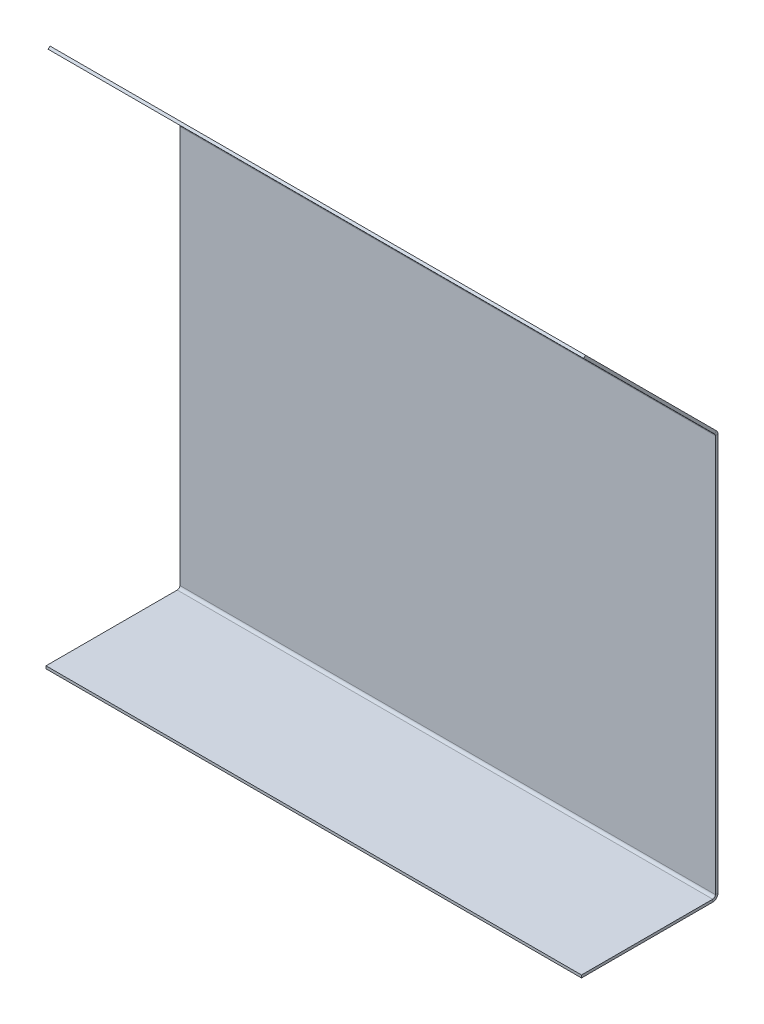
ISO-10303-21;
HEADER;
FILE_DESCRIPTION(('STEP AP214'),'2;1');
FILE_NAME('part.step','',(''),(''),'','','');
FILE_SCHEMA(('AUTOMOTIVE_DESIGN { 1 0 10303 214 1 1 1 1 }'));
ENDSEC;
DATA;
#1=APPLICATION_CONTEXT('core data for automotive mechanical design processes');
#2=APPLICATION_PROTOCOL_DEFINITION('international standard','automotive_design',2000,#1);
#3=PRODUCT_CONTEXT('',#1,'mechanical');
#4=PRODUCT('Part','Part','',(#3));
#5=PRODUCT_RELATED_PRODUCT_CATEGORY('part','',(#4));
#6=PRODUCT_DEFINITION_FORMATION('','',#4);
#7=PRODUCT_DEFINITION_CONTEXT('part definition',#1,'design');
#8=PRODUCT_DEFINITION('design','',#6,#7);
#9=PRODUCT_DEFINITION_SHAPE('','',#8);
#10=(LENGTH_UNIT() NAMED_UNIT(*) SI_UNIT(.MILLI.,.METRE.));
#11=(NAMED_UNIT(*) PLANE_ANGLE_UNIT() SI_UNIT($,.RADIAN.));
#12=(NAMED_UNIT(*) SI_UNIT($,.STERADIAN.) SOLID_ANGLE_UNIT());
#13=UNCERTAINTY_MEASURE_WITH_UNIT(LENGTH_MEASURE(1.E-05),#10,'distance_accuracy_value','');
#14=(GEOMETRIC_REPRESENTATION_CONTEXT(3) GLOBAL_UNCERTAINTY_ASSIGNED_CONTEXT((#13)) GLOBAL_UNIT_ASSIGNED_CONTEXT((#10,
#11,#12)) REPRESENTATION_CONTEXT('',''));
#15=CARTESIAN_POINT('',(0.,0.,0.));
#16=DIRECTION('',(0.,0.,1.));
#17=DIRECTION('',(1.,0.,0.));
#18=AXIS2_PLACEMENT_3D('',#15,#16,#17);
#19=CARTESIAN_POINT('',(0.,0.,-25.4));
#20=DIRECTION('',(0.,0.,1.));
#21=DIRECTION('',(0.,-1.,0.));
#22=AXIS2_PLACEMENT_3D('',#19,#20,#21);
#23=PLANE('',#22);
#24=DIRECTION('',(0.,-1.,0.));
#25=VECTOR('',#24,1.);
#26=CARTESIAN_POINT('',(101.6,0.,-25.4));
#27=LINE('',#26,#25);
#28=CARTESIAN_POINT('',(101.6,151.810951377452,-25.4000000000005));
#29=VERTEX_POINT('',#28);
#30=CARTESIAN_POINT('',(101.6,0.999999999999985,-25.4));
#31=VERTEX_POINT('',#30);
#32=EDGE_CURVE('E56',#29,#31,#27,.T.);
#33=ORIENTED_EDGE('',*,*,#32,.F.);
#34=DIRECTION('',(-1.,0.,0.));
#35=VECTOR('',#34,1.);
#36=CARTESIAN_POINT('',(0.,151.810951377452,-25.4000000000005));
#37=LINE('',#36,#35);
#38=CARTESIAN_POINT('',(-101.6,151.810951377452,-25.4000000000005));
#39=VERTEX_POINT('',#38);
#40=EDGE_CURVE('E48',#29,#39,#37,.T.);
#41=ORIENTED_EDGE('',*,*,#40,.T.);
#42=DIRECTION('',(0.,1.,0.));
#43=VECTOR('',#42,1.);
#44=CARTESIAN_POINT('',(-101.6,223.282,-25.4000000000008));
#45=LINE('',#44,#43);
#46=CARTESIAN_POINT('',(-101.6,0.999999999999985,-25.4));
#47=VERTEX_POINT('',#46);
#48=EDGE_CURVE('E64',#47,#39,#45,.T.);
#49=ORIENTED_EDGE('',*,*,#48,.F.);
#50=DIRECTION('',(-1.,0.,0.));
#51=VECTOR('',#50,1.);
#52=CARTESIAN_POINT('',(101.6,0.999999999999997,-25.4));
#53=LINE('',#52,#51);
#54=EDGE_CURVE('E174',#31,#47,#53,.T.);
#55=ORIENTED_EDGE('',*,*,#54,.F.);
#56=EDGE_LOOP('',(#33,#41,#49,#55));
#57=FACE_BOUND('',#56,.T.);
#58=ADVANCED_FACE('F39',(#57),#23,.T.);
#59=CARTESIAN_POINT('',(-101.6,-1.,25.4));
#60=DIRECTION('',(-1.,0.,0.));
#61=DIRECTION('',(0.,0.,1.));
#62=AXIS2_PLACEMENT_3D('',#59,#60,#61);
#63=PLANE('',#62);
#64=DIRECTION('',(0.,0.,1.));
#65=VECTOR('',#64,1.);
#66=CARTESIAN_POINT('',(-101.6,0.,25.4));
#67=LINE('',#66,#65);
#68=CARTESIAN_POINT('',(-101.6,0.,-24.4));
#69=VERTEX_POINT('',#68);
#70=CARTESIAN_POINT('',(-101.6,0.,25.4));
#71=VERTEX_POINT('',#70);
#72=EDGE_CURVE('E220',#69,#71,#67,.T.);
#73=ORIENTED_EDGE('',*,*,#72,.F.);
#74=DIRECTION('',(0.,-1.,0.));
#75=VECTOR('',#74,1.);
#76=CARTESIAN_POINT('',(-101.6,0.,-24.4));
#77=LINE('',#76,#75);
#78=CARTESIAN_POINT('',(-101.6,-1.00000000000001,-24.4));
#79=VERTEX_POINT('',#78);
#80=EDGE_CURVE('E191',#69,#79,#77,.T.);
#81=ORIENTED_EDGE('',*,*,#80,.T.);
#82=DIRECTION('',(0.,0.,1.));
#83=VECTOR('',#82,1.);
#84=CARTESIAN_POINT('',(-101.6,-1.,25.4));
#85=LINE('',#84,#83);
#86=CARTESIAN_POINT('',(-101.6,-1.,25.4));
#87=VERTEX_POINT('',#86);
#88=EDGE_CURVE('E211',#79,#87,#85,.T.);
#89=ORIENTED_EDGE('',*,*,#88,.T.);
#90=DIRECTION('',(0.,1.,0.));
#91=VECTOR('',#90,1.);
#92=CARTESIAN_POINT('',(-101.6,-1.,25.4));
#93=LINE('',#92,#91);
#94=EDGE_CURVE('E217',#87,#71,#93,.T.);
#95=ORIENTED_EDGE('',*,*,#94,.T.);
#96=EDGE_LOOP('',(#73,#81,#89,#95));
#97=FACE_BOUND('',#96,.T.);
#98=ADVANCED_FACE('F285',(#97),#63,.T.);
#99=CARTESIAN_POINT('',(0.,-1.,0.));
#100=DIRECTION('',(0.,-1.,0.));
#101=DIRECTION('',(0.,0.,-1.));
#102=AXIS2_PLACEMENT_3D('',#99,#100,#101);
#103=PLANE('',#102);
#104=ORIENTED_EDGE('',*,*,#88,.F.);
#105=DIRECTION('',(-1.,0.,0.));
#106=VECTOR('',#105,1.);
#107=CARTESIAN_POINT('',(-101.6,-1.00000000000001,-24.4));
#108=LINE('',#107,#106);
#109=CARTESIAN_POINT('',(101.6,-1.,-24.4));
#110=VERTEX_POINT('',#109);
#111=EDGE_CURVE('E184',#79,#110,#108,.F.);
#112=ORIENTED_EDGE('',*,*,#111,.T.);
#113=DIRECTION('',(0.,0.,-1.));
#114=VECTOR('',#113,1.);
#115=CARTESIAN_POINT('',(101.6,-1.,25.4));
#116=LINE('',#115,#114);
#117=CARTESIAN_POINT('',(101.6,-1.,25.4));
#118=VERTEX_POINT('',#117);
#119=EDGE_CURVE('E208',#118,#110,#116,.T.);
#120=ORIENTED_EDGE('',*,*,#119,.F.);
#121=DIRECTION('',(1.,0.,0.));
#122=VECTOR('',#121,1.);
#123=CARTESIAN_POINT('',(-101.6,-1.,25.4));
#124=LINE('',#123,#122);
#125=EDGE_CURVE('E214',#87,#118,#124,.T.);
#126=ORIENTED_EDGE('',*,*,#125,.F.);
#127=EDGE_LOOP('',(#104,#112,#120,#126));
#128=FACE_BOUND('',#127,.T.);
#129=ADVANCED_FACE('F289',(#128),#103,.T.);
#130=CARTESIAN_POINT('',(0.,0.,0.));
#131=DIRECTION('',(0.,-1.,0.));
#132=DIRECTION('',(0.,0.,-1.));
#133=AXIS2_PLACEMENT_3D('',#130,#131,#132);
#134=PLANE('',#133);
#135=DIRECTION('',(-1.,0.,0.));
#136=VECTOR('',#135,1.);
#137=CARTESIAN_POINT('',(-101.6,0.,-24.4));
#138=LINE('',#137,#136);
#139=CARTESIAN_POINT('',(101.6,0.,-24.4));
#140=VERTEX_POINT('',#139);
#141=EDGE_CURVE('E197',#69,#140,#138,.F.);
#142=ORIENTED_EDGE('',*,*,#141,.F.);
#143=ORIENTED_EDGE('',*,*,#72,.T.);
#144=DIRECTION('',(1.,0.,0.));
#145=VECTOR('',#144,1.);
#146=CARTESIAN_POINT('',(-101.6,0.,25.4));
#147=LINE('',#146,#145);
#148=CARTESIAN_POINT('',(101.6,0.,25.4));
#149=VERTEX_POINT('',#148);
#150=EDGE_CURVE('E212',#71,#149,#147,.T.);
#151=ORIENTED_EDGE('',*,*,#150,.T.);
#152=DIRECTION('',(0.,0.,-1.));
#153=VECTOR('',#152,1.);
#154=CARTESIAN_POINT('',(101.6,0.,25.4));
#155=LINE('',#154,#153);
#156=EDGE_CURVE('E205',#149,#140,#155,.T.);
#157=ORIENTED_EDGE('',*,*,#156,.T.);
#158=EDGE_LOOP('',(#142,#143,#151,#157));
#159=FACE_BOUND('',#158,.T.);
#160=ADVANCED_FACE('F302',(#159),#134,.F.);
#161=CARTESIAN_POINT('',(101.6,-1.,25.4));
#162=DIRECTION('',(1.,0.,0.));
#163=DIRECTION('',(0.,0.,-1.));
#164=AXIS2_PLACEMENT_3D('',#161,#162,#163);
#165=PLANE('',#164);
#166=DIRECTION('',(0.,-1.,0.));
#167=VECTOR('',#166,1.);
#168=CARTESIAN_POINT('',(101.6,0.,-24.4));
#169=LINE('',#168,#167);
#170=EDGE_CURVE('E202',#140,#110,#169,.T.);
#171=ORIENTED_EDGE('',*,*,#170,.F.);
#172=ORIENTED_EDGE('',*,*,#156,.F.);
#173=DIRECTION('',(0.,1.,0.));
#174=VECTOR('',#173,1.);
#175=CARTESIAN_POINT('',(101.6,-1.,25.4));
#176=LINE('',#175,#174);
#177=EDGE_CURVE('E224',#118,#149,#176,.T.);
#178=ORIENTED_EDGE('',*,*,#177,.F.);
#179=ORIENTED_EDGE('',*,*,#119,.T.);
#180=EDGE_LOOP('',(#171,#172,#178,#179));
#181=FACE_BOUND('',#180,.T.);
#182=ADVANCED_FACE('F299',(#181),#165,.T.);
#183=CARTESIAN_POINT('',(-101.6,-1.,25.4));
#184=DIRECTION('',(0.,0.,1.));
#185=DIRECTION('',(1.,0.,0.));
#186=AXIS2_PLACEMENT_3D('',#183,#184,#185);
#187=PLANE('',#186);
#188=ORIENTED_EDGE('',*,*,#150,.F.);
#189=ORIENTED_EDGE('',*,*,#94,.F.);
#190=ORIENTED_EDGE('',*,*,#125,.T.);
#191=ORIENTED_EDGE('',*,*,#177,.T.);
#192=EDGE_LOOP('',(#188,#189,#190,#191));
#193=FACE_BOUND('',#192,.T.);
#194=ADVANCED_FACE('F301',(#193),#187,.T.);
#195=CARTESIAN_POINT('',(101.6,0.999999999999989,-24.4));
#196=DIRECTION('',(1.,0.,0.));
#197=DIRECTION('',(0.,0.,-1.));
#198=AXIS2_PLACEMENT_3D('',#195,#196,#197);
#199=PLANE('',#198);
#200=DIRECTION('',(0.,0.,-1.));
#201=VECTOR('',#200,1.);
#202=CARTESIAN_POINT('',(101.6,0.999999999999997,-25.4));
#203=LINE('',#202,#201);
#204=CARTESIAN_POINT('',(101.6,0.999999999999982,-26.4));
#205=VERTEX_POINT('',#204);
#206=EDGE_CURVE('E168',#31,#205,#203,.T.);
#207=ORIENTED_EDGE('',*,*,#206,.F.);
#208=CARTESIAN_POINT('',(101.6,0.999999999999989,-24.4));
#209=DIRECTION('',(-1.,0.,0.));
#210=DIRECTION('',(0.,0.,1.));
#211=AXIS2_PLACEMENT_3D('',#208,#209,#210);
#212=CIRCLE('',#211,1.);
#213=EDGE_CURVE('E194',#140,#31,#212,.F.);
#214=ORIENTED_EDGE('',*,*,#213,.F.);
#215=ORIENTED_EDGE('',*,*,#170,.T.);
#216=CARTESIAN_POINT('',(101.6,0.999999999999989,-24.4));
#217=DIRECTION('',(-1.,0.,0.));
#218=DIRECTION('',(0.,0.,1.));
#219=AXIS2_PLACEMENT_3D('',#216,#217,#218);
#220=CIRCLE('',#219,2.);
#221=EDGE_CURVE('E187',#110,#205,#220,.F.);
#222=ORIENTED_EDGE('',*,*,#221,.T.);
#223=EDGE_LOOP('',(#207,#214,#215,#222));
#224=FACE_BOUND('',#223,.T.);
#225=ADVANCED_FACE('F247',(#224),#199,.T.);
#226=CARTESIAN_POINT('',(-101.6,0.999999999999989,-24.4));
#227=DIRECTION('',(1.,0.,0.));
#228=DIRECTION('',(0.,0.,-1.));
#229=AXIS2_PLACEMENT_3D('',#226,#227,#228);
#230=PLANE('',#229);
#231=CARTESIAN_POINT('',(-101.6,0.999999999999989,-24.4));
#232=DIRECTION('',(-1.,0.,0.));
#233=DIRECTION('',(0.,0.,1.));
#234=AXIS2_PLACEMENT_3D('',#231,#232,#233);
#235=CIRCLE('',#234,1.);
#236=EDGE_CURVE('E199',#47,#69,#235,.T.);
#237=ORIENTED_EDGE('',*,*,#236,.F.);
#238=DIRECTION('',(0.,0.,-1.));
#239=VECTOR('',#238,1.);
#240=CARTESIAN_POINT('',(-101.6,0.999999999999994,-25.4));
#241=LINE('',#240,#239);
#242=CARTESIAN_POINT('',(-101.6,1.,-26.4));
#243=VERTEX_POINT('',#242);
#244=EDGE_CURVE('E176',#47,#243,#241,.T.);
#245=ORIENTED_EDGE('',*,*,#244,.T.);
#246=CARTESIAN_POINT('',(-101.6,0.999999999999989,-24.4));
#247=DIRECTION('',(-1.,0.,0.));
#248=DIRECTION('',(0.,0.,1.));
#249=AXIS2_PLACEMENT_3D('',#246,#247,#248);
#250=CIRCLE('',#249,2.);
#251=EDGE_CURVE('E188',#243,#79,#250,.T.);
#252=ORIENTED_EDGE('',*,*,#251,.T.);
#253=ORIENTED_EDGE('',*,*,#80,.F.);
#254=EDGE_LOOP('',(#237,#245,#252,#253));
#255=FACE_BOUND('',#254,.T.);
#256=ADVANCED_FACE('F314',(#255),#230,.F.);
#257=CARTESIAN_POINT('',(-101.6,0.999999999999989,-24.4));
#258=DIRECTION('',(-1.,0.,0.));
#259=DIRECTION('',(0.,0.,-1.));
#260=AXIS2_PLACEMENT_3D('',#257,#258,#259);
#261=CYLINDRICAL_SURFACE('',#260,2.);
#262=ORIENTED_EDGE('',*,*,#111,.F.);
#263=ORIENTED_EDGE('',*,*,#251,.F.);
#264=DIRECTION('',(1.,0.,0.));
#265=VECTOR('',#264,1.);
#266=CARTESIAN_POINT('',(0.,1.,-26.4));
#267=LINE('',#266,#265);
#268=EDGE_CURVE('E179',#243,#205,#267,.T.);
#269=ORIENTED_EDGE('',*,*,#268,.T.);
#270=ORIENTED_EDGE('',*,*,#221,.F.);
#271=EDGE_LOOP('',(#262,#263,#269,#270));
#272=FACE_BOUND('',#271,.T.);
#273=ADVANCED_FACE('F244',(#272),#261,.T.);
#274=CARTESIAN_POINT('',(-101.6,0.999999999999989,-24.4));
#275=DIRECTION('',(-1.,0.,0.));
#276=DIRECTION('',(0.,0.,-1.));
#277=AXIS2_PLACEMENT_3D('',#274,#275,#276);
#278=CYLINDRICAL_SURFACE('',#277,1.);
#279=ORIENTED_EDGE('',*,*,#141,.T.);
#280=ORIENTED_EDGE('',*,*,#213,.T.);
#281=ORIENTED_EDGE('',*,*,#54,.T.);
#282=ORIENTED_EDGE('',*,*,#236,.T.);
#283=EDGE_LOOP('',(#279,#280,#281,#282));
#284=FACE_BOUND('',#283,.T.);
#285=ADVANCED_FACE('F296',(#284),#278,.F.);
#286=CARTESIAN_POINT('',(-101.6,223.282,-26.4000000000008));
#287=DIRECTION('',(1.,0.,0.));
#288=DIRECTION('',(0.,0.,-1.));
#289=AXIS2_PLACEMENT_3D('',#286,#287,#288);
#290=PLANE('',#289);
#291=DIRECTION('',(0.,0.,1.));
#292=VECTOR('',#291,1.);
#293=CARTESIAN_POINT('',(-101.6,151.810951377452,-26.4000000000013));
#294=LINE('',#293,#292);
#295=CARTESIAN_POINT('',(-101.6,151.810951377452,-26.4000000000005));
#296=VERTEX_POINT('',#295);
#297=EDGE_CURVE('E231',#296,#39,#294,.T.);
#298=ORIENTED_EDGE('',*,*,#297,.F.);
#299=DIRECTION('',(0.,1.,0.));
#300=VECTOR('',#299,1.);
#301=CARTESIAN_POINT('',(-101.6,223.282,-26.4000000000008));
#302=LINE('',#301,#300);
#303=EDGE_CURVE('E236',#243,#296,#302,.T.);
#304=ORIENTED_EDGE('',*,*,#303,.F.);
#305=ORIENTED_EDGE('',*,*,#244,.F.);
#306=ORIENTED_EDGE('',*,*,#48,.T.);
#307=EDGE_LOOP('',(#298,#304,#305,#306));
#308=FACE_BOUND('',#307,.T.);
#309=ADVANCED_FACE('F293',(#308),#290,.F.);
#310=CARTESIAN_POINT('',(101.6,0.,-26.4));
#311=DIRECTION('',(-1.,0.,0.));
#312=DIRECTION('',(0.,0.,1.));
#313=AXIS2_PLACEMENT_3D('',#310,#311,#312);
#314=PLANE('',#313);
#315=DIRECTION('',(0.,0.,-1.));
#316=VECTOR('',#315,1.);
#317=CARTESIAN_POINT('',(101.6,151.810951377452,-26.3999999999989));
#318=LINE('',#317,#316);
#319=CARTESIAN_POINT('',(101.6,151.810951377452,-26.4000000000005));
#320=VERTEX_POINT('',#319);
#321=EDGE_CURVE('E12',#29,#320,#318,.T.);
#322=ORIENTED_EDGE('',*,*,#321,.F.);
#323=ORIENTED_EDGE('',*,*,#32,.T.);
#324=ORIENTED_EDGE('',*,*,#206,.T.);
#325=DIRECTION('',(0.,-1.,0.));
#326=VECTOR('',#325,1.);
#327=CARTESIAN_POINT('',(101.6,0.,-26.4));
#328=LINE('',#327,#326);
#329=EDGE_CURVE('E43',#320,#205,#328,.T.);
#330=ORIENTED_EDGE('',*,*,#329,.F.);
#331=EDGE_LOOP('',(#322,#323,#324,#330));
#332=FACE_BOUND('',#331,.T.);
#333=ADVANCED_FACE('F41',(#332),#314,.F.);
#334=CARTESIAN_POINT('',(0.,0.,-26.4));
#335=DIRECTION('',(0.,0.,1.));
#336=DIRECTION('',(0.,-1.,0.));
#337=AXIS2_PLACEMENT_3D('',#334,#335,#336);
#338=PLANE('',#337);
#339=DIRECTION('',(-1.,0.,0.));
#340=VECTOR('',#339,1.);
#341=CARTESIAN_POINT('',(0.,151.810951377452,-26.4000000000005));
#342=LINE('',#341,#340);
#343=EDGE_CURVE('E226',#320,#296,#342,.T.);
#344=ORIENTED_EDGE('',*,*,#343,.F.);
#345=ORIENTED_EDGE('',*,*,#329,.T.);
#346=ORIENTED_EDGE('',*,*,#268,.F.);
#347=ORIENTED_EDGE('',*,*,#303,.T.);
#348=EDGE_LOOP('',(#344,#345,#346,#347));
#349=FACE_BOUND('',#348,.T.);
#350=ADVANCED_FACE('F241',(#349),#338,.F.);
#351=CARTESIAN_POINT('',(101.6,151.810951377452,-24.4000000000005));
#352=DIRECTION('',(1.,0.,0.));
#353=DIRECTION('',(0.,0.,-1.));
#354=AXIS2_PLACEMENT_3D('',#351,#352,#353);
#355=PLANE('',#354);
#356=DIRECTION('',(0.,0.707106781186554,-0.707106781186541));
#357=VECTOR('',#356,1.);
#358=CARTESIAN_POINT('',(101.6,153.225164939824,-25.8142135623725));
#359=LINE('',#358,#357);
#360=CARTESIAN_POINT('',(101.6,152.518058158638,-25.1071067811871));
#361=VERTEX_POINT('',#360);
#362=CARTESIAN_POINT('',(101.6,153.225164939825,-25.8142135623736));
#363=VERTEX_POINT('',#362);
#364=EDGE_CURVE('E260',#361,#363,#359,.T.);
#365=ORIENTED_EDGE('',*,*,#364,.F.);
#366=CARTESIAN_POINT('',(101.6,151.810951377452,-24.4000000000005));
#367=DIRECTION('',(1.,0.,0.));
#368=DIRECTION('',(0.,0.,-1.));
#369=AXIS2_PLACEMENT_3D('',#366,#367,#368);
#370=CIRCLE('',#369,1.);
#371=EDGE_CURVE('E170',#361,#29,#370,.F.);
#372=ORIENTED_EDGE('',*,*,#371,.T.);
#373=ORIENTED_EDGE('',*,*,#321,.T.);
#374=CARTESIAN_POINT('',(101.6,151.810951377452,-24.4000000000005));
#375=DIRECTION('',(-1.,0.,0.));
#376=DIRECTION('',(0.,0.,1.));
#377=AXIS2_PLACEMENT_3D('',#374,#375,#376);
#378=CIRCLE('',#377,2.);
#379=EDGE_CURVE('E161',#363,#320,#378,.T.);
#380=ORIENTED_EDGE('',*,*,#379,.F.);
#381=EDGE_LOOP('',(#365,#372,#373,#380));
#382=FACE_BOUND('',#381,.T.);
#383=ADVANCED_FACE('F258',(#382),#355,.T.);
#384=CARTESIAN_POINT('',(-101.6,151.810951377452,-24.4000000000005));
#385=DIRECTION('',(-1.,0.,0.));
#386=DIRECTION('',(0.,0.,1.));
#387=AXIS2_PLACEMENT_3D('',#384,#385,#386);
#388=PLANE('',#387);
#389=ORIENTED_EDGE('',*,*,#297,.T.);
#390=CARTESIAN_POINT('',(-101.6,151.810951377452,-24.4000000000005));
#391=DIRECTION('',(1.,0.,0.));
#392=DIRECTION('',(0.,0.,-1.));
#393=AXIS2_PLACEMENT_3D('',#390,#391,#392);
#394=CIRCLE('',#393,1.);
#395=CARTESIAN_POINT('',(-101.6,152.518058158638,-25.1071067811871));
#396=VERTEX_POINT('',#395);
#397=EDGE_CURVE('E165',#39,#396,#394,.T.);
#398=ORIENTED_EDGE('',*,*,#397,.T.);
#399=DIRECTION('',(0.,-0.707106781186554,0.707106781186541));
#400=VECTOR('',#399,1.);
#401=CARTESIAN_POINT('',(-101.6,153.225164939825,-25.8142135623741));
#402=LINE('',#401,#400);
#403=CARTESIAN_POINT('',(-101.6,153.225164939825,-25.8142135623736));
#404=VERTEX_POINT('',#403);
#405=EDGE_CURVE('E138',#404,#396,#402,.T.);
#406=ORIENTED_EDGE('',*,*,#405,.F.);
#407=CARTESIAN_POINT('',(-101.6,151.810951377452,-24.4000000000005));
#408=DIRECTION('',(1.,0.,0.));
#409=DIRECTION('',(0.,0.,-1.));
#410=AXIS2_PLACEMENT_3D('',#407,#408,#409);
#411=CIRCLE('',#410,2.);
#412=EDGE_CURVE('E164',#296,#404,#411,.T.);
#413=ORIENTED_EDGE('',*,*,#412,.F.);
#414=EDGE_LOOP('',(#389,#398,#406,#413));
#415=FACE_BOUND('',#414,.T.);
#416=ADVANCED_FACE('F327',(#415),#388,.T.);
#417=CARTESIAN_POINT('',(-203.20587568552,151.810951377452,-24.4000000000005));
#418=DIRECTION('',(1.,0.,0.));
#419=DIRECTION('',(0.,0.,-1.));
#420=AXIS2_PLACEMENT_3D('',#417,#418,#419);
#421=CYLINDRICAL_SURFACE('',#420,2.);
#422=ORIENTED_EDGE('',*,*,#412,.T.);
#423=DIRECTION('',(-1.,0.,0.));
#424=VECTOR('',#423,1.);
#425=CARTESIAN_POINT('',(0.,153.225164939825,-25.8142135623736));
#426=LINE('',#425,#424);
#427=EDGE_CURVE('E272',#363,#404,#426,.T.);
#428=ORIENTED_EDGE('',*,*,#427,.F.);
#429=ORIENTED_EDGE('',*,*,#379,.T.);
#430=ORIENTED_EDGE('',*,*,#343,.T.);
#431=EDGE_LOOP('',(#422,#428,#429,#430));
#432=FACE_BOUND('',#431,.T.);
#433=ADVANCED_FACE('F330',(#432),#421,.T.);
#434=CARTESIAN_POINT('',(-203.20587568552,151.810951377452,-24.4000000000005));
#435=DIRECTION('',(1.,0.,0.));
#436=DIRECTION('',(0.,0.,-1.));
#437=AXIS2_PLACEMENT_3D('',#434,#435,#436);
#438=CYLINDRICAL_SURFACE('',#437,1.);
#439=ORIENTED_EDGE('',*,*,#397,.F.);
#440=ORIENTED_EDGE('',*,*,#40,.F.);
#441=ORIENTED_EDGE('',*,*,#371,.F.);
#442=DIRECTION('',(-1.,0.,0.));
#443=VECTOR('',#442,1.);
#444=CARTESIAN_POINT('',(0.,152.518058158638,-25.1071067811871));
#445=LINE('',#444,#443);
#446=EDGE_CURVE('E155',#361,#396,#445,.T.);
#447=ORIENTED_EDGE('',*,*,#446,.T.);
#448=EDGE_LOOP('',(#439,#440,#441,#447));
#449=FACE_BOUND('',#448,.T.);
#450=ADVANCED_FACE('F256',(#449),#438,.F.);
#451=CARTESIAN_POINT('',(101.6,202.929787528438,23.8904090262388));
#452=DIRECTION('',(0.,-0.707106781186549,-0.707106781186546));
#453=DIRECTION('',(0.,0.707106781186546,-0.707106781186549));
#454=AXIS2_PLACEMENT_3D('',#451,#452,#453);
#455=PLANE('',#454);
#456=DIRECTION('',(1.,0.,0.));
#457=VECTOR('',#456,1.);
#458=CARTESIAN_POINT('',(101.6,202.222680747251,24.5975158074254));
#459=LINE('',#458,#457);
#460=CARTESIAN_POINT('',(-101.6,202.222680747251,24.5975158074254));
#461=VERTEX_POINT('',#460);
#462=CARTESIAN_POINT('',(101.6,202.222680747251,24.5975158074254));
#463=VERTEX_POINT('',#462);
#464=EDGE_CURVE('E148',#461,#463,#459,.T.);
#465=ORIENTED_EDGE('',*,*,#464,.T.);
#466=DIRECTION('',(0.,-0.707106781186546,0.707106781186549));
#467=VECTOR('',#466,1.);
#468=CARTESIAN_POINT('',(101.6,202.929787528438,23.8904090262388));
#469=LINE('',#468,#467);
#470=CARTESIAN_POINT('',(101.6,202.929787528438,23.8904090262388));
#471=VERTEX_POINT('',#470);
#472=EDGE_CURVE('E173',#471,#463,#469,.T.);
#473=ORIENTED_EDGE('',*,*,#472,.F.);
#474=DIRECTION('',(1.,0.,0.));
#475=VECTOR('',#474,1.);
#476=CARTESIAN_POINT('',(101.6,202.929787528438,23.8904090262388));
#477=LINE('',#476,#475);
#478=CARTESIAN_POINT('',(-101.6,202.929787528438,23.8904090262388));
#479=VERTEX_POINT('',#478);
#480=EDGE_CURVE('E150',#479,#471,#477,.T.);
#481=ORIENTED_EDGE('',*,*,#480,.F.);
#482=DIRECTION('',(0.,-0.707106781186546,0.707106781186549));
#483=VECTOR('',#482,1.);
#484=CARTESIAN_POINT('',(-101.6,202.929787528438,23.8904090262388));
#485=LINE('',#484,#483);
#486=EDGE_CURVE('E135',#479,#461,#485,.T.);
#487=ORIENTED_EDGE('',*,*,#486,.T.);
#488=EDGE_LOOP('',(#465,#473,#481,#487));
#489=FACE_BOUND('',#488,.T.);
#490=ADVANCED_FACE('F146',(#489),#455,.F.);
#491=CARTESIAN_POINT('',(0.,45.0455712115425,-133.993807290656));
#492=DIRECTION('',(0.,-0.707106781186546,0.707106781186549));
#493=DIRECTION('',(0.,-0.707106781186549,-0.707106781186546));
#494=AXIS2_PLACEMENT_3D('',#491,#492,#493);
#495=PLANE('',#494);
#496=DIRECTION('',(0.,-0.707106781186549,-0.707106781186546));
#497=VECTOR('',#496,1.);
#498=CARTESIAN_POINT('',(101.6,45.0455712115426,-133.993807290656));
#499=LINE('',#498,#497);
#500=EDGE_CURVE('E151',#471,#363,#499,.T.);
#501=ORIENTED_EDGE('',*,*,#500,.T.);
#502=ORIENTED_EDGE('',*,*,#427,.T.);
#503=DIRECTION('',(0.,0.707106781186549,0.707106781186546));
#504=VECTOR('',#503,1.);
#505=CARTESIAN_POINT('',(-101.6,202.929787528438,23.8904090262388));
#506=LINE('',#505,#504);
#507=EDGE_CURVE('E270',#404,#479,#506,.T.);
#508=ORIENTED_EDGE('',*,*,#507,.T.);
#509=ORIENTED_EDGE('',*,*,#480,.T.);
#510=EDGE_LOOP('',(#501,#502,#508,#509));
#511=FACE_BOUND('',#510,.T.);
#512=ADVANCED_FACE('F275',(#511),#495,.F.);
#513=CARTESIAN_POINT('',(-101.6,202.929787528438,23.8904090262388));
#514=DIRECTION('',(1.,0.,0.));
#515=DIRECTION('',(0.,0.707106781186549,-0.707106781186546));
#516=AXIS2_PLACEMENT_3D('',#513,#514,#515);
#517=PLANE('',#516);
#518=ORIENTED_EDGE('',*,*,#507,.F.);
#519=ORIENTED_EDGE('',*,*,#405,.T.);
#520=DIRECTION('',(0.,0.707106781186549,0.707106781186546));
#521=VECTOR('',#520,1.);
#522=CARTESIAN_POINT('',(-101.6,202.222680747251,24.5975158074254));
#523=LINE('',#522,#521);
#524=EDGE_CURVE('E132',#396,#461,#523,.T.);
#525=ORIENTED_EDGE('',*,*,#524,.T.);
#526=ORIENTED_EDGE('',*,*,#486,.F.);
#527=EDGE_LOOP('',(#518,#519,#525,#526));
#528=FACE_BOUND('',#527,.T.);
#529=ADVANCED_FACE('F134',(#528),#517,.F.);
#530=CARTESIAN_POINT('',(0.,44.338464430356,-133.286700509469));
#531=DIRECTION('',(0.,-0.707106781186546,0.707106781186549));
#532=DIRECTION('',(0.,-0.707106781186549,-0.707106781186546));
#533=AXIS2_PLACEMENT_3D('',#530,#531,#532);
#534=PLANE('',#533);
#535=ORIENTED_EDGE('',*,*,#446,.F.);
#536=DIRECTION('',(0.,-0.707106781186549,-0.707106781186546));
#537=VECTOR('',#536,1.);
#538=CARTESIAN_POINT('',(101.6,44.338464430356,-133.286700509469));
#539=LINE('',#538,#537);
#540=EDGE_CURVE('E143',#463,#361,#539,.T.);
#541=ORIENTED_EDGE('',*,*,#540,.F.);
#542=ORIENTED_EDGE('',*,*,#464,.F.);
#543=ORIENTED_EDGE('',*,*,#524,.F.);
#544=EDGE_LOOP('',(#535,#541,#542,#543));
#545=FACE_BOUND('',#544,.T.);
#546=ADVANCED_FACE('F154',(#545),#534,.T.);
#547=CARTESIAN_POINT('',(101.6,45.0455712115426,-133.993807290656));
#548=DIRECTION('',(-1.,0.,0.));
#549=DIRECTION('',(0.,-0.707106781186549,0.707106781186546));
#550=AXIS2_PLACEMENT_3D('',#547,#548,#549);
#551=PLANE('',#550);
#552=ORIENTED_EDGE('',*,*,#540,.T.);
#553=ORIENTED_EDGE('',*,*,#364,.T.);
#554=ORIENTED_EDGE('',*,*,#500,.F.);
#555=ORIENTED_EDGE('',*,*,#472,.T.);
#556=EDGE_LOOP('',(#552,#553,#554,#555));
#557=FACE_BOUND('',#556,.T.);
#558=ADVANCED_FACE('F276',(#557),#551,.F.);
#559=CLOSED_SHELL('',(#58,#98,#129,#160,#182,#194,#225,#256,#273,#285,#309,#333,#350,#383,#416,
#433,#450,#490,#512,#529,#546,#558));
#560=MANIFOLD_SOLID_BREP('B2',#559);
#561=ADVANCED_BREP_SHAPE_REPRESENTATION('',(#18,#560),#14);
#562=SHAPE_DEFINITION_REPRESENTATION(#9,#561);
ENDSEC;
END-ISO-10303-21;
